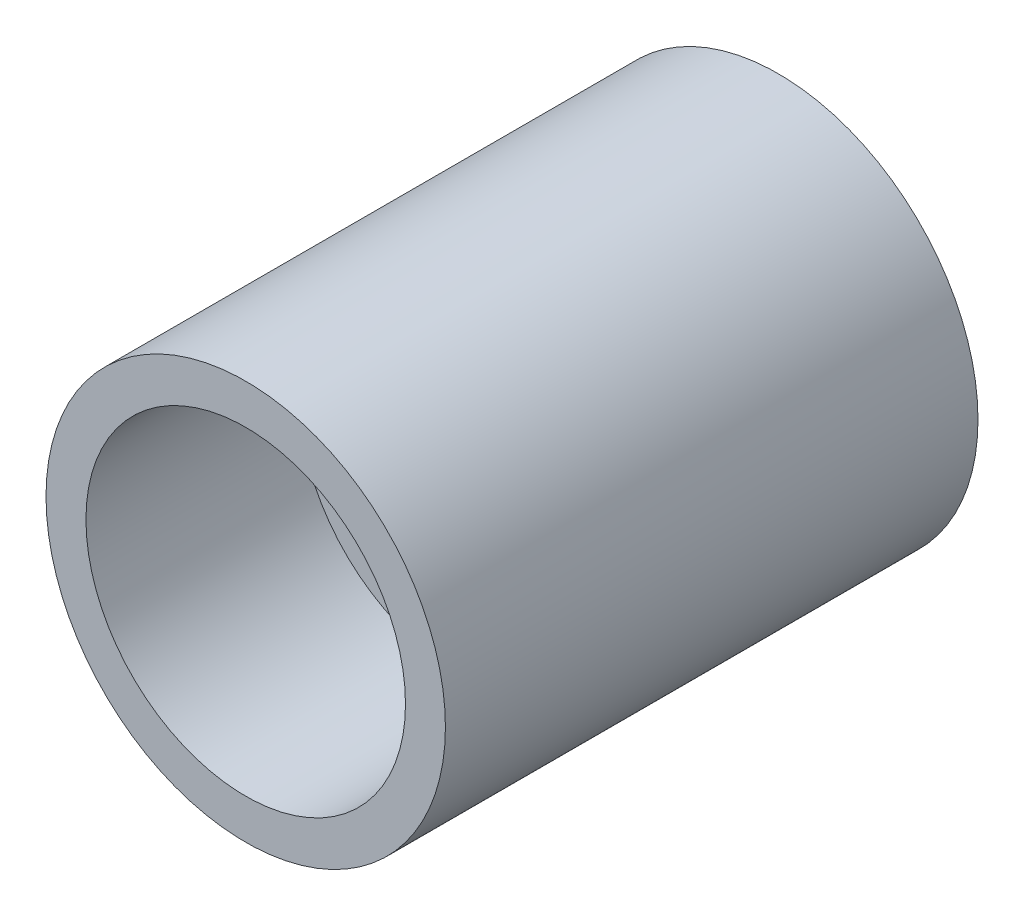
ISO-10303-21;
HEADER;
FILE_DESCRIPTION(('STEP AP214'),'2;1');
FILE_NAME('part.step','',(''),(''),'','','');
FILE_SCHEMA(('AUTOMOTIVE_DESIGN { 1 0 10303 214 1 1 1 1 }'));
ENDSEC;
DATA;
#1=APPLICATION_CONTEXT('core data for automotive mechanical design processes');
#2=APPLICATION_PROTOCOL_DEFINITION('international standard','automotive_design',2000,#1);
#3=PRODUCT_CONTEXT('',#1,'mechanical');
#4=PRODUCT('Part','Part','',(#3));
#5=PRODUCT_RELATED_PRODUCT_CATEGORY('part','',(#4));
#6=PRODUCT_DEFINITION_FORMATION('','',#4);
#7=PRODUCT_DEFINITION_CONTEXT('part definition',#1,'design');
#8=PRODUCT_DEFINITION('design','',#6,#7);
#9=PRODUCT_DEFINITION_SHAPE('','',#8);
#10=(LENGTH_UNIT() NAMED_UNIT(*) SI_UNIT(.MILLI.,.METRE.));
#11=(NAMED_UNIT(*) PLANE_ANGLE_UNIT() SI_UNIT($,.RADIAN.));
#12=(NAMED_UNIT(*) SI_UNIT($,.STERADIAN.) SOLID_ANGLE_UNIT());
#13=UNCERTAINTY_MEASURE_WITH_UNIT(LENGTH_MEASURE(1.E-05),#10,'distance_accuracy_value','');
#14=(GEOMETRIC_REPRESENTATION_CONTEXT(3) GLOBAL_UNCERTAINTY_ASSIGNED_CONTEXT((#13)) GLOBAL_UNIT_ASSIGNED_CONTEXT((#10,
#11,#12)) REPRESENTATION_CONTEXT('',''));
#15=CARTESIAN_POINT('',(0.,0.,0.));
#16=DIRECTION('',(0.,0.,1.));
#17=DIRECTION('',(1.,0.,0.));
#18=AXIS2_PLACEMENT_3D('',#15,#16,#17);
#19=CARTESIAN_POINT('',(0.,0.,-6.));
#20=DIRECTION('',(0.,0.,-1.));
#21=DIRECTION('',(-1.,0.,0.));
#22=AXIS2_PLACEMENT_3D('',#19,#20,#21);
#23=PLANE('',#22);
#24=CARTESIAN_POINT('',(0.,0.,-6.));
#25=DIRECTION('',(0.,0.,-1.));
#26=DIRECTION('',(-1.,0.,0.));
#27=AXIS2_PLACEMENT_3D('',#24,#25,#26);
#28=CIRCLE('',#27,3.75);
#29=CARTESIAN_POINT('',(-3.75,0.,-6.));
#30=VERTEX_POINT('',#29);
#31=EDGE_CURVE('E62',#30,#30,#28,.T.);
#32=ORIENTED_EDGE('',*,*,#31,.T.);
#33=EDGE_LOOP('',(#32));
#34=FACE_BOUND('',#33,.T.);
#35=CARTESIAN_POINT('',(0.,0.,-6.));
#36=DIRECTION('',(0.,0.,-1.));
#37=DIRECTION('',(-1.,0.,0.));
#38=AXIS2_PLACEMENT_3D('',#35,#36,#37);
#39=CIRCLE('',#38,2.);
#40=CARTESIAN_POINT('',(-2.,0.,-6.));
#41=VERTEX_POINT('',#40);
#42=EDGE_CURVE('E72',#41,#41,#39,.T.);
#43=ORIENTED_EDGE('',*,*,#42,.F.);
#44=EDGE_LOOP('',(#43));
#45=FACE_BOUND('',#44,.T.);
#46=ADVANCED_FACE('F41',(#34,#45),#23,.T.);
#47=CARTESIAN_POINT('',(0.,0.,4.));
#48=DIRECTION('',(0.,0.,1.));
#49=DIRECTION('',(1.,0.,0.));
#50=AXIS2_PLACEMENT_3D('',#47,#48,#49);
#51=PLANE('',#50);
#52=CARTESIAN_POINT('',(0.,0.,4.));
#53=DIRECTION('',(0.,0.,1.));
#54=DIRECTION('',(1.,0.,0.));
#55=AXIS2_PLACEMENT_3D('',#52,#53,#54);
#56=CIRCLE('',#55,3.75);
#57=CARTESIAN_POINT('',(3.75,0.,4.));
#58=VERTEX_POINT('',#57);
#59=EDGE_CURVE('E10',#58,#58,#56,.T.);
#60=ORIENTED_EDGE('',*,*,#59,.T.);
#61=EDGE_LOOP('',(#60));
#62=FACE_BOUND('',#61,.T.);
#63=CARTESIAN_POINT('',(0.,0.,4.));
#64=DIRECTION('',(0.,0.,1.));
#65=DIRECTION('',(1.,0.,0.));
#66=AXIS2_PLACEMENT_3D('',#63,#64,#65);
#67=CIRCLE('',#66,3.);
#68=CARTESIAN_POINT('',(3.,0.,4.));
#69=VERTEX_POINT('',#68);
#70=EDGE_CURVE('E49',#69,#69,#67,.T.);
#71=ORIENTED_EDGE('',*,*,#70,.F.);
#72=EDGE_LOOP('',(#71));
#73=FACE_BOUND('',#72,.T.);
#74=ADVANCED_FACE('F102',(#62,#73),#51,.T.);
#75=CARTESIAN_POINT('',(0.,0.,4.));
#76=DIRECTION('',(0.,0.,-1.));
#77=DIRECTION('',(-1.,0.,0.));
#78=AXIS2_PLACEMENT_3D('',#75,#76,#77);
#79=CYLINDRICAL_SURFACE('',#78,3.75);
#80=ORIENTED_EDGE('',*,*,#59,.F.);
#81=EDGE_LOOP('',(#80));
#82=FACE_BOUND('',#81,.T.);
#83=ORIENTED_EDGE('',*,*,#31,.F.);
#84=EDGE_LOOP('',(#83));
#85=FACE_BOUND('',#84,.T.);
#86=ADVANCED_FACE('F43',(#82,#85),#79,.T.);
#87=CARTESIAN_POINT('',(0.,0.,4.));
#88=DIRECTION('',(0.,0.,-1.));
#89=DIRECTION('',(-1.,0.,0.));
#90=AXIS2_PLACEMENT_3D('',#87,#88,#89);
#91=CYLINDRICAL_SURFACE('',#90,3.);
#92=ORIENTED_EDGE('',*,*,#70,.T.);
#93=EDGE_LOOP('',(#92));
#94=FACE_BOUND('',#93,.T.);
#95=CARTESIAN_POINT('',(0.,0.,0.));
#96=DIRECTION('',(0.,0.,1.));
#97=DIRECTION('',(1.,0.,0.));
#98=AXIS2_PLACEMENT_3D('',#95,#96,#97);
#99=CIRCLE('',#98,3.);
#100=CARTESIAN_POINT('',(3.,0.,0.));
#101=VERTEX_POINT('',#100);
#102=EDGE_CURVE('E55',#101,#101,#99,.T.);
#103=ORIENTED_EDGE('',*,*,#102,.F.);
#104=EDGE_LOOP('',(#103));
#105=FACE_BOUND('',#104,.T.);
#106=ADVANCED_FACE('F112',(#94,#105),#91,.F.);
#107=CARTESIAN_POINT('',(0.,0.,0.));
#108=DIRECTION('',(0.,0.,-1.));
#109=DIRECTION('',(-1.,0.,0.));
#110=AXIS2_PLACEMENT_3D('',#107,#108,#109);
#111=PLANE('',#110);
#112=CARTESIAN_POINT('',(0.,0.,0.));
#113=DIRECTION('',(0.,0.,-1.));
#114=DIRECTION('',(-1.,0.,0.));
#115=AXIS2_PLACEMENT_3D('',#112,#113,#114);
#116=CIRCLE('',#115,1.);
#117=CARTESIAN_POINT('',(-1.,0.,0.));
#118=VERTEX_POINT('',#117);
#119=EDGE_CURVE('E67',#118,#118,#116,.T.);
#120=ORIENTED_EDGE('',*,*,#119,.T.);
#121=EDGE_LOOP('',(#120));
#122=FACE_BOUND('',#121,.T.);
#123=ORIENTED_EDGE('',*,*,#102,.T.);
#124=EDGE_LOOP('',(#123));
#125=FACE_BOUND('',#124,.T.);
#126=ADVANCED_FACE('F98',(#122,#125),#111,.F.);
#127=CARTESIAN_POINT('',(0.,0.,-6.));
#128=DIRECTION('',(0.,0.,1.));
#129=DIRECTION('',(1.,0.,0.));
#130=AXIS2_PLACEMENT_3D('',#127,#128,#129);
#131=CYLINDRICAL_SURFACE('',#130,1.);
#132=ORIENTED_EDGE('',*,*,#119,.F.);
#133=EDGE_LOOP('',(#132));
#134=FACE_BOUND('',#133,.T.);
#135=CARTESIAN_POINT('',(0.,0.,-7.));
#136=DIRECTION('',(0.,0.,-1.));
#137=DIRECTION('',(-1.,0.,0.));
#138=AXIS2_PLACEMENT_3D('',#135,#136,#137);
#139=CIRCLE('',#138,1.);
#140=CARTESIAN_POINT('',(-1.,0.,-7.));
#141=VERTEX_POINT('',#140);
#142=EDGE_CURVE('E76',#141,#141,#139,.T.);
#143=ORIENTED_EDGE('',*,*,#142,.T.);
#144=EDGE_LOOP('',(#143));
#145=FACE_BOUND('',#144,.T.);
#146=ADVANCED_FACE('F85',(#134,#145),#131,.F.);
#147=CARTESIAN_POINT('',(0.,0.,-7.));
#148=DIRECTION('',(0.,0.,-1.));
#149=DIRECTION('',(-1.,0.,0.));
#150=AXIS2_PLACEMENT_3D('',#147,#148,#149);
#151=PLANE('',#150);
#152=CARTESIAN_POINT('',(0.,0.,-7.));
#153=DIRECTION('',(0.,0.,-1.));
#154=DIRECTION('',(-1.,0.,0.));
#155=AXIS2_PLACEMENT_3D('',#152,#153,#154);
#156=CIRCLE('',#155,2.);
#157=CARTESIAN_POINT('',(-2.,0.,-7.));
#158=VERTEX_POINT('',#157);
#159=EDGE_CURVE('E71',#158,#158,#156,.T.);
#160=ORIENTED_EDGE('',*,*,#159,.T.);
#161=EDGE_LOOP('',(#160));
#162=FACE_BOUND('',#161,.T.);
#163=ORIENTED_EDGE('',*,*,#142,.F.);
#164=EDGE_LOOP('',(#163));
#165=FACE_BOUND('',#164,.T.);
#166=ADVANCED_FACE('F87',(#162,#165),#151,.T.);
#167=CARTESIAN_POINT('',(0.,0.,-7.));
#168=DIRECTION('',(0.,0.,1.));
#169=DIRECTION('',(1.,0.,0.));
#170=AXIS2_PLACEMENT_3D('',#167,#168,#169);
#171=CYLINDRICAL_SURFACE('',#170,2.);
#172=ORIENTED_EDGE('',*,*,#159,.F.);
#173=EDGE_LOOP('',(#172));
#174=FACE_BOUND('',#173,.T.);
#175=ORIENTED_EDGE('',*,*,#42,.T.);
#176=EDGE_LOOP('',(#175));
#177=FACE_BOUND('',#176,.T.);
#178=ADVANCED_FACE('F89',(#174,#177),#171,.T.);
#179=CLOSED_SHELL('',(#46,#74,#86,#106,#126,#146,#166,#178));
#180=MANIFOLD_SOLID_BREP('B2',#179);
#181=ADVANCED_BREP_SHAPE_REPRESENTATION('',(#18,#180),#14);
#182=SHAPE_DEFINITION_REPRESENTATION(#9,#181);
ENDSEC;
END-ISO-10303-21;
